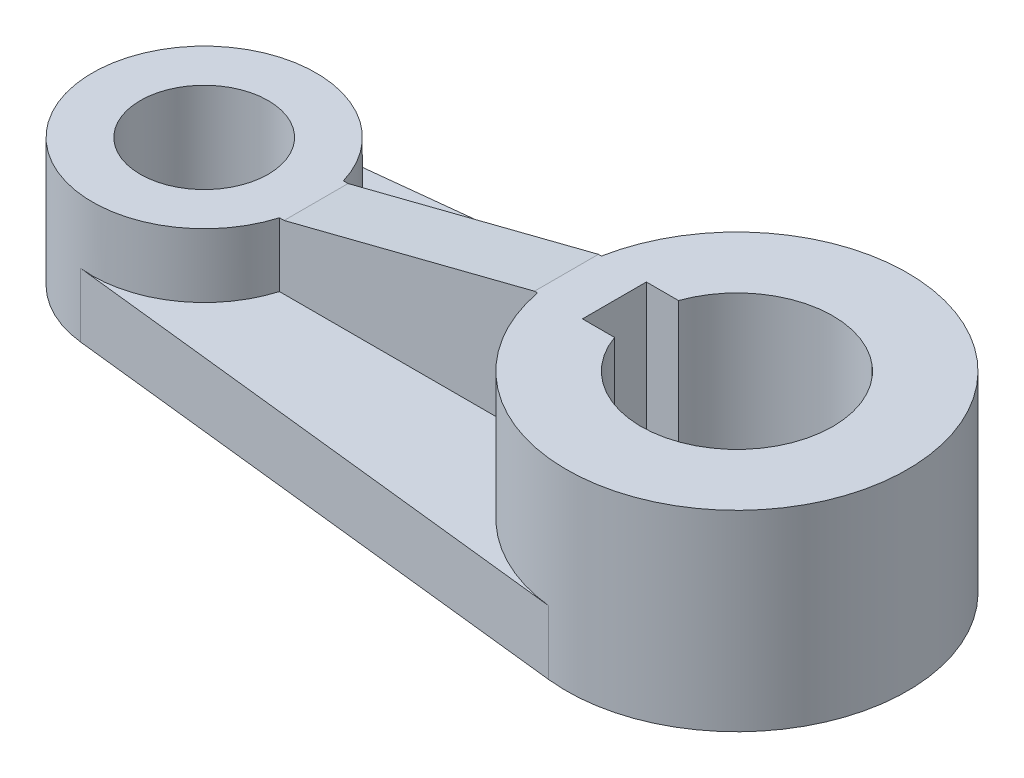
ISO-10303-21;
HEADER;
FILE_DESCRIPTION(('STEP AP214'),'2;1');
FILE_NAME('part.step','',(''),(''),'','','');
FILE_SCHEMA(('AUTOMOTIVE_DESIGN { 1 0 10303 214 1 1 1 1 }'));
ENDSEC;
DATA;
#1=APPLICATION_CONTEXT('core data for automotive mechanical design processes');
#2=APPLICATION_PROTOCOL_DEFINITION('international standard','automotive_design',2000,#1);
#3=PRODUCT_CONTEXT('',#1,'mechanical');
#4=PRODUCT('Part','Part','',(#3));
#5=PRODUCT_RELATED_PRODUCT_CATEGORY('part','',(#4));
#6=PRODUCT_DEFINITION_FORMATION('','',#4);
#7=PRODUCT_DEFINITION_CONTEXT('part definition',#1,'design');
#8=PRODUCT_DEFINITION('design','',#6,#7);
#9=PRODUCT_DEFINITION_SHAPE('','',#8);
#10=(LENGTH_UNIT() NAMED_UNIT(*) SI_UNIT(.MILLI.,.METRE.));
#11=(NAMED_UNIT(*) PLANE_ANGLE_UNIT() SI_UNIT($,.RADIAN.));
#12=(NAMED_UNIT(*) SI_UNIT($,.STERADIAN.) SOLID_ANGLE_UNIT());
#13=UNCERTAINTY_MEASURE_WITH_UNIT(LENGTH_MEASURE(1.E-05),#10,'distance_accuracy_value','');
#14=(GEOMETRIC_REPRESENTATION_CONTEXT(3) GLOBAL_UNCERTAINTY_ASSIGNED_CONTEXT((#13)) GLOBAL_UNIT_ASSIGNED_CONTEXT((#10,
#11,#12)) REPRESENTATION_CONTEXT('',''));
#15=CARTESIAN_POINT('',(0.,0.,0.));
#16=DIRECTION('',(0.,0.,1.));
#17=DIRECTION('',(1.,0.,0.));
#18=AXIS2_PLACEMENT_3D('',#15,#16,#17);
#19=CARTESIAN_POINT('',(-100.,12.,0.));
#20=DIRECTION('',(0.,-1.,0.));
#21=DIRECTION('',(0.,0.,-1.));
#22=AXIS2_PLACEMENT_3D('',#19,#20,#21);
#23=PLANE('',#22);
#24=DIRECTION('',(1.,0.,0.));
#25=VECTOR('',#24,1.);
#26=CARTESIAN_POINT('',(-30.3336555417471,12.,6.));
#27=LINE('',#26,#25);
#28=CARTESIAN_POINT('',(-79.8753882025019,12.,6.));
#29=VERTEX_POINT('',#28);
#30=CARTESIAN_POINT('',(-31.4324672910034,12.,6.));
#31=VERTEX_POINT('',#30);
#32=EDGE_CURVE('E154',#29,#31,#27,.T.);
#33=ORIENTED_EDGE('',*,*,#32,.F.);
#34=CARTESIAN_POINT('',(-100.,12.,0.));
#35=DIRECTION('',(0.,-1.,0.));
#36=DIRECTION('',(0.,0.,-1.));
#37=AXIS2_PLACEMENT_3D('',#34,#35,#36);
#38=CIRCLE('',#37,21.);
#39=CARTESIAN_POINT('',(-102.31,12.,20.8725633308418));
#40=VERTEX_POINT('',#39);
#41=EDGE_CURVE('E247',#40,#29,#38,.F.);
#42=ORIENTED_EDGE('',*,*,#41,.F.);
#43=DIRECTION('',(-0.993931587182941,0.,-0.11));
#44=VECTOR('',#43,1.);
#45=CARTESIAN_POINT('',(-102.31,12.,20.8725633308418));
#46=LINE('',#45,#44);
#47=CARTESIAN_POINT('',(-3.52,12.,31.8058107898541));
#48=VERTEX_POINT('',#47);
#49=EDGE_CURVE('E260',#48,#40,#46,.T.);
#50=ORIENTED_EDGE('',*,*,#49,.F.);
#51=CARTESIAN_POINT('',(0.,12.,0.));
#52=DIRECTION('',(0.,-1.,0.));
#53=DIRECTION('',(0.,0.,-1.));
#54=AXIS2_PLACEMENT_3D('',#51,#52,#53);
#55=CIRCLE('',#54,32.);
#56=EDGE_CURVE('E290',#48,#31,#55,.T.);
#57=ORIENTED_EDGE('',*,*,#56,.T.);
#58=EDGE_LOOP('',(#33,#42,#50,#57));
#59=FACE_BOUND('',#58,.T.);
#60=ADVANCED_FACE('F45',(#59),#23,.F.);
#61=CARTESIAN_POINT('',(0.,36.,0.));
#62=DIRECTION('',(0.,-1.,0.));
#63=DIRECTION('',(0.,0.,-1.));
#64=AXIS2_PLACEMENT_3D('',#61,#62,#63);
#65=CYLINDRICAL_SURFACE('',#64,32.);
#66=DIRECTION('',(0.,-1.,0.));
#67=VECTOR('',#66,1.);
#68=CARTESIAN_POINT('',(-31.4324672910034,36.,6.));
#69=LINE('',#68,#67);
#70=CARTESIAN_POINT('',(-31.4324672910034,36.,6.));
#71=VERTEX_POINT('',#70);
#72=EDGE_CURVE('E151',#31,#71,#69,.F.);
#73=ORIENTED_EDGE('',*,*,#72,.F.);
#74=ORIENTED_EDGE('',*,*,#56,.F.);
#75=DIRECTION('',(0.,-1.,0.));
#76=VECTOR('',#75,1.);
#77=CARTESIAN_POINT('',(-3.52,12.,31.8058107898541));
#78=LINE('',#77,#76);
#79=CARTESIAN_POINT('',(-3.52,0.,31.8058107898541));
#80=VERTEX_POINT('',#79);
#81=EDGE_CURVE('E280',#48,#80,#78,.T.);
#82=ORIENTED_EDGE('',*,*,#81,.T.);
#83=CARTESIAN_POINT('',(0.,0.,0.));
#84=DIRECTION('',(0.,1.,0.));
#85=DIRECTION('',(0.,0.,1.));
#86=AXIS2_PLACEMENT_3D('',#83,#84,#85);
#87=CIRCLE('',#86,32.);
#88=CARTESIAN_POINT('',(-3.52,0.,-31.8058107898541));
#89=VERTEX_POINT('',#88);
#90=EDGE_CURVE('E49',#80,#89,#87,.T.);
#91=ORIENTED_EDGE('',*,*,#90,.T.);
#92=DIRECTION('',(0.,-1.,0.));
#93=VECTOR('',#92,1.);
#94=CARTESIAN_POINT('',(-3.52000000000001,12.,-31.8058107898541));
#95=LINE('',#94,#93);
#96=CARTESIAN_POINT('',(-3.52000000000001,12.,-31.8058107898541));
#97=VERTEX_POINT('',#96);
#98=EDGE_CURVE('E284',#97,#89,#95,.T.);
#99=ORIENTED_EDGE('',*,*,#98,.F.);
#100=CARTESIAN_POINT('',(-31.4324672910034,12.,-6.));
#101=VERTEX_POINT('',#100);
#102=EDGE_CURVE('E279',#101,#97,#55,.T.);
#103=ORIENTED_EDGE('',*,*,#102,.F.);
#104=DIRECTION('',(0.,-1.,0.));
#105=VECTOR('',#104,1.);
#106=CARTESIAN_POINT('',(-31.4324672910034,36.,-6.));
#107=LINE('',#106,#105);
#108=CARTESIAN_POINT('',(-31.4324672910034,36.,-6.));
#109=VERTEX_POINT('',#108);
#110=EDGE_CURVE('E64',#101,#109,#107,.F.);
#111=ORIENTED_EDGE('',*,*,#110,.T.);
#112=CARTESIAN_POINT('',(0.,36.,0.));
#113=DIRECTION('',(0.,1.,0.));
#114=DIRECTION('',(0.,0.,1.));
#115=AXIS2_PLACEMENT_3D('',#112,#113,#114);
#116=CIRCLE('',#115,32.);
#117=EDGE_CURVE('E11',#71,#109,#116,.T.);
#118=ORIENTED_EDGE('',*,*,#117,.F.);
#119=EDGE_LOOP('',(#73,#74,#82,#91,#99,#103,#111,#118));
#120=FACE_BOUND('',#119,.T.);
#121=ADVANCED_FACE('F47',(#120),#65,.T.);
#122=CARTESIAN_POINT('',(-100.,12.,0.));
#123=DIRECTION('',(0.,-1.,0.));
#124=DIRECTION('',(0.,0.,-1.));
#125=AXIS2_PLACEMENT_3D('',#122,#123,#124);
#126=CYLINDRICAL_SURFACE('',#125,21.);
#127=ORIENTED_EDGE('',*,*,#41,.T.);
#128=DIRECTION('',(0.,-1.,0.));
#129=VECTOR('',#128,1.);
#130=CARTESIAN_POINT('',(-79.8753882025019,12.,6.));
#131=LINE('',#130,#129);
#132=CARTESIAN_POINT('',(-79.8753882025019,24.,6.));
#133=VERTEX_POINT('',#132);
#134=EDGE_CURVE('E197',#29,#133,#131,.F.);
#135=ORIENTED_EDGE('',*,*,#134,.T.);
#136=CARTESIAN_POINT('',(-100.,24.,0.));
#137=DIRECTION('',(0.,1.,0.));
#138=DIRECTION('',(0.,0.,1.));
#139=AXIS2_PLACEMENT_3D('',#136,#137,#138);
#140=CIRCLE('',#139,21.);
#141=CARTESIAN_POINT('',(-79.8753882025019,24.,-6.));
#142=VERTEX_POINT('',#141);
#143=EDGE_CURVE('E242',#142,#133,#140,.T.);
#144=ORIENTED_EDGE('',*,*,#143,.F.);
#145=DIRECTION('',(0.,-1.,0.));
#146=VECTOR('',#145,1.);
#147=CARTESIAN_POINT('',(-79.8753882025019,12.,-6.));
#148=LINE('',#147,#146);
#149=CARTESIAN_POINT('',(-79.8753882025019,12.,-6.));
#150=VERTEX_POINT('',#149);
#151=EDGE_CURVE('E166',#150,#142,#148,.F.);
#152=ORIENTED_EDGE('',*,*,#151,.F.);
#153=CARTESIAN_POINT('',(-102.31,12.,-20.8725633308418));
#154=VERTEX_POINT('',#153);
#155=EDGE_CURVE('E246',#150,#154,#38,.F.);
#156=ORIENTED_EDGE('',*,*,#155,.T.);
#157=DIRECTION('',(0.,-1.,0.));
#158=VECTOR('',#157,1.);
#159=CARTESIAN_POINT('',(-102.31,12.,-20.8725633308418));
#160=LINE('',#159,#158);
#161=CARTESIAN_POINT('',(-102.31,0.,-20.8725633308418));
#162=VERTEX_POINT('',#161);
#163=EDGE_CURVE('E265',#154,#162,#160,.T.);
#164=ORIENTED_EDGE('',*,*,#163,.T.);
#165=CARTESIAN_POINT('',(-100.,0.,0.));
#166=DIRECTION('',(0.,-1.,0.));
#167=DIRECTION('',(0.,0.,-1.));
#168=AXIS2_PLACEMENT_3D('',#165,#166,#167);
#169=CIRCLE('',#168,21.);
#170=CARTESIAN_POINT('',(-102.31,0.,20.8725633308418));
#171=VERTEX_POINT('',#170);
#172=EDGE_CURVE('E255',#171,#162,#169,.T.);
#173=ORIENTED_EDGE('',*,*,#172,.F.);
#174=DIRECTION('',(0.,-1.,0.));
#175=VECTOR('',#174,1.);
#176=CARTESIAN_POINT('',(-102.31,12.,20.8725633308418));
#177=LINE('',#176,#175);
#178=EDGE_CURVE('E276',#40,#171,#177,.T.);
#179=ORIENTED_EDGE('',*,*,#178,.F.);
#180=EDGE_LOOP('',(#127,#135,#144,#152,#156,#164,#173,#179));
#181=FACE_BOUND('',#180,.T.);
#182=ADVANCED_FACE('F336',(#181),#126,.T.);
#183=ORIENTED_EDGE('',*,*,#155,.F.);
#184=DIRECTION('',(1.,0.,0.));
#185=VECTOR('',#184,1.);
#186=CARTESIAN_POINT('',(-30.3336555417471,12.,-6.));
#187=LINE('',#186,#185);
#188=EDGE_CURVE('E178',#150,#101,#187,.T.);
#189=ORIENTED_EDGE('',*,*,#188,.T.);
#190=ORIENTED_EDGE('',*,*,#102,.T.);
#191=DIRECTION('',(0.993931587182941,0.,-0.11));
#192=VECTOR('',#191,1.);
#193=CARTESIAN_POINT('',(-102.31,12.,-20.8725633308418));
#194=LINE('',#193,#192);
#195=EDGE_CURVE('E256',#154,#97,#194,.T.);
#196=ORIENTED_EDGE('',*,*,#195,.F.);
#197=EDGE_LOOP('',(#183,#189,#190,#196));
#198=FACE_BOUND('',#197,.T.);
#199=ADVANCED_FACE('F332',(#198),#23,.F.);
#200=CARTESIAN_POINT('',(0.,36.,0.));
#201=DIRECTION('',(0.,1.,0.));
#202=DIRECTION('',(0.,0.,1.));
#203=AXIS2_PLACEMENT_3D('',#200,#201,#202);
#204=PLANE('',#203);
#205=DIRECTION('',(-1.,0.,0.));
#206=VECTOR('',#205,1.);
#207=CARTESIAN_POINT('',(-32.,36.,6.));
#208=LINE('',#207,#206);
#209=CARTESIAN_POINT('',(-32.,36.,6.));
#210=VERTEX_POINT('',#209);
#211=EDGE_CURVE('E143',#71,#210,#208,.T.);
#212=ORIENTED_EDGE('',*,*,#211,.F.);
#213=ORIENTED_EDGE('',*,*,#117,.T.);
#214=DIRECTION('',(-1.,0.,0.));
#215=VECTOR('',#214,1.);
#216=CARTESIAN_POINT('',(-32.,36.,-6.));
#217=LINE('',#216,#215);
#218=CARTESIAN_POINT('',(-32.,36.,-6.));
#219=VERTEX_POINT('',#218);
#220=EDGE_CURVE('E161',#109,#219,#217,.T.);
#221=ORIENTED_EDGE('',*,*,#220,.T.);
#222=DIRECTION('',(0.,0.,-1.));
#223=VECTOR('',#222,1.);
#224=CARTESIAN_POINT('',(-32.,36.,6.));
#225=LINE('',#224,#223);
#226=EDGE_CURVE('E157',#210,#219,#225,.T.);
#227=ORIENTED_EDGE('',*,*,#226,.F.);
#228=EDGE_LOOP('',(#212,#213,#221,#227));
#229=FACE_BOUND('',#228,.T.);
#230=DIRECTION('',(-1.,0.,0.));
#231=VECTOR('',#230,1.);
#232=CARTESIAN_POINT('',(-23.0005627484771,36.,-6.));
#233=LINE('',#232,#231);
#234=CARTESIAN_POINT('',(-16.9705627484771,36.,-6.));
#235=VERTEX_POINT('',#234);
#236=CARTESIAN_POINT('',(-23.0005627484771,36.,-6.));
#237=VERTEX_POINT('',#236);
#238=EDGE_CURVE('E208',#235,#237,#233,.T.);
#239=ORIENTED_EDGE('',*,*,#238,.F.);
#240=CARTESIAN_POINT('',(0.,36.,0.));
#241=DIRECTION('',(0.,1.,0.));
#242=DIRECTION('',(0.,0.,1.));
#243=AXIS2_PLACEMENT_3D('',#240,#241,#242);
#244=CIRCLE('',#243,18.);
#245=CARTESIAN_POINT('',(-16.9705627484771,36.,6.00000000000001));
#246=VERTEX_POINT('',#245);
#247=EDGE_CURVE('E295',#246,#235,#244,.T.);
#248=ORIENTED_EDGE('',*,*,#247,.F.);
#249=DIRECTION('',(1.,0.,0.));
#250=VECTOR('',#249,1.);
#251=CARTESIAN_POINT('',(-23.0005627484771,36.,6.));
#252=LINE('',#251,#250);
#253=CARTESIAN_POINT('',(-23.0005627484771,36.,6.));
#254=VERTEX_POINT('',#253);
#255=EDGE_CURVE('E220',#254,#246,#252,.T.);
#256=ORIENTED_EDGE('',*,*,#255,.F.);
#257=DIRECTION('',(0.,0.,1.));
#258=VECTOR('',#257,1.);
#259=CARTESIAN_POINT('',(-23.0005627484771,36.,-6.));
#260=LINE('',#259,#258);
#261=EDGE_CURVE('E202',#237,#254,#260,.T.);
#262=ORIENTED_EDGE('',*,*,#261,.F.);
#263=EDGE_LOOP('',(#239,#248,#256,#262));
#264=FACE_BOUND('',#263,.T.);
#265=ADVANCED_FACE('F158',(#229,#264),#204,.T.);
#266=CARTESIAN_POINT('',(0.,0.,0.));
#267=DIRECTION('',(0.,1.,0.));
#268=DIRECTION('',(0.,0.,1.));
#269=AXIS2_PLACEMENT_3D('',#266,#267,#268);
#270=PLANE('',#269);
#271=ORIENTED_EDGE('',*,*,#172,.T.);
#272=DIRECTION('',(0.993931587182941,0.,-0.11));
#273=VECTOR('',#272,1.);
#274=CARTESIAN_POINT('',(-102.31,0.,-20.8725633308418));
#275=LINE('',#274,#273);
#276=EDGE_CURVE('E269',#162,#89,#275,.T.);
#277=ORIENTED_EDGE('',*,*,#276,.T.);
#278=ORIENTED_EDGE('',*,*,#90,.F.);
#279=DIRECTION('',(-0.993931587182941,0.,-0.11));
#280=VECTOR('',#279,1.);
#281=CARTESIAN_POINT('',(-102.31,0.,20.8725633308418));
#282=LINE('',#281,#280);
#283=EDGE_CURVE('E261',#80,#171,#282,.T.);
#284=ORIENTED_EDGE('',*,*,#283,.T.);
#285=EDGE_LOOP('',(#271,#277,#278,#284));
#286=FACE_BOUND('',#285,.T.);
#287=CARTESIAN_POINT('',(-100.,0.,0.));
#288=DIRECTION('',(0.,-1.,0.));
#289=DIRECTION('',(0.,0.,-1.));
#290=AXIS2_PLACEMENT_3D('',#287,#288,#289);
#291=CIRCLE('',#290,12.);
#292=CARTESIAN_POINT('',(-100.,0.,-12.));
#293=VERTEX_POINT('',#292);
#294=EDGE_CURVE('E251',#293,#293,#291,.T.);
#295=ORIENTED_EDGE('',*,*,#294,.F.);
#296=EDGE_LOOP('',(#295));
#297=FACE_BOUND('',#296,.T.);
#298=CARTESIAN_POINT('',(0.,0.,0.));
#299=DIRECTION('',(0.,1.,0.));
#300=DIRECTION('',(0.,0.,1.));
#301=AXIS2_PLACEMENT_3D('',#298,#299,#300);
#302=CIRCLE('',#301,18.);
#303=CARTESIAN_POINT('',(-16.9705627484771,0.,6.00000000000001));
#304=VERTEX_POINT('',#303);
#305=CARTESIAN_POINT('',(-16.9705627484771,0.,-6.));
#306=VERTEX_POINT('',#305);
#307=EDGE_CURVE('E294',#304,#306,#302,.T.);
#308=ORIENTED_EDGE('',*,*,#307,.T.);
#309=DIRECTION('',(-1.,0.,0.));
#310=VECTOR('',#309,1.);
#311=CARTESIAN_POINT('',(-23.0005627484771,0.,-6.));
#312=LINE('',#311,#310);
#313=CARTESIAN_POINT('',(-23.0005627484771,0.,-6.));
#314=VERTEX_POINT('',#313);
#315=EDGE_CURVE('E212',#306,#314,#312,.T.);
#316=ORIENTED_EDGE('',*,*,#315,.T.);
#317=DIRECTION('',(0.,0.,1.));
#318=VECTOR('',#317,1.);
#319=CARTESIAN_POINT('',(-23.0005627484771,0.,-6.));
#320=LINE('',#319,#318);
#321=CARTESIAN_POINT('',(-23.0005627484771,0.,6.));
#322=VERTEX_POINT('',#321);
#323=EDGE_CURVE('E203',#314,#322,#320,.T.);
#324=ORIENTED_EDGE('',*,*,#323,.T.);
#325=DIRECTION('',(1.,0.,0.));
#326=VECTOR('',#325,1.);
#327=CARTESIAN_POINT('',(-23.0005627484771,0.,6.));
#328=LINE('',#327,#326);
#329=EDGE_CURVE('E207',#322,#304,#328,.T.);
#330=ORIENTED_EDGE('',*,*,#329,.T.);
#331=EDGE_LOOP('',(#308,#316,#324,#330));
#332=FACE_BOUND('',#331,.T.);
#333=ADVANCED_FACE('F303',(#286,#297,#332),#270,.F.);
#334=CARTESIAN_POINT('',(0.,36.,0.));
#335=DIRECTION('',(0.,-1.,0.));
#336=DIRECTION('',(0.,0.,-1.));
#337=AXIS2_PLACEMENT_3D('',#334,#335,#336);
#338=CYLINDRICAL_SURFACE('',#337,18.);
#339=DIRECTION('',(0.,1.,0.));
#340=VECTOR('',#339,1.);
#341=CARTESIAN_POINT('',(-16.9705627484771,0.,-6.));
#342=LINE('',#341,#340);
#343=EDGE_CURVE('E230',#306,#235,#342,.T.);
#344=ORIENTED_EDGE('',*,*,#343,.F.);
#345=ORIENTED_EDGE('',*,*,#307,.F.);
#346=DIRECTION('',(0.,1.,0.));
#347=VECTOR('',#346,1.);
#348=CARTESIAN_POINT('',(-16.9705627484771,0.,6.00000000000001));
#349=LINE('',#348,#347);
#350=EDGE_CURVE('E233',#304,#246,#349,.T.);
#351=ORIENTED_EDGE('',*,*,#350,.T.);
#352=ORIENTED_EDGE('',*,*,#247,.T.);
#353=EDGE_LOOP('',(#344,#345,#351,#352));
#354=FACE_BOUND('',#353,.T.);
#355=ADVANCED_FACE('F307',(#354),#338,.F.);
#356=CARTESIAN_POINT('',(-102.31,12.,20.8725633308418));
#357=DIRECTION('',(-0.11,0.,0.993931587182941));
#358=DIRECTION('',(0.993931587182941,0.,0.11));
#359=AXIS2_PLACEMENT_3D('',#356,#357,#358);
#360=PLANE('',#359);
#361=ORIENTED_EDGE('',*,*,#283,.F.);
#362=ORIENTED_EDGE('',*,*,#81,.F.);
#363=ORIENTED_EDGE('',*,*,#49,.T.);
#364=ORIENTED_EDGE('',*,*,#178,.T.);
#365=EDGE_LOOP('',(#361,#362,#363,#364));
#366=FACE_BOUND('',#365,.T.);
#367=ADVANCED_FACE('F366',(#366),#360,.T.);
#368=CARTESIAN_POINT('',(-102.31,12.,-20.8725633308418));
#369=DIRECTION('',(-0.11,0.,-0.993931587182941));
#370=DIRECTION('',(-0.993931587182941,0.,0.11));
#371=AXIS2_PLACEMENT_3D('',#368,#369,#370);
#372=PLANE('',#371);
#373=ORIENTED_EDGE('',*,*,#276,.F.);
#374=ORIENTED_EDGE('',*,*,#163,.F.);
#375=ORIENTED_EDGE('',*,*,#195,.T.);
#376=ORIENTED_EDGE('',*,*,#98,.T.);
#377=EDGE_LOOP('',(#373,#374,#375,#376));
#378=FACE_BOUND('',#377,.T.);
#379=ADVANCED_FACE('F373',(#378),#372,.T.);
#380=CARTESIAN_POINT('',(-100.,12.,0.));
#381=DIRECTION('',(0.,-1.,0.));
#382=DIRECTION('',(0.,0.,-1.));
#383=AXIS2_PLACEMENT_3D('',#380,#381,#382);
#384=CYLINDRICAL_SURFACE('',#383,12.);
#385=ORIENTED_EDGE('',*,*,#294,.T.);
#386=EDGE_LOOP('',(#385));
#387=FACE_BOUND('',#386,.T.);
#388=CARTESIAN_POINT('',(-100.,24.,0.));
#389=DIRECTION('',(0.,1.,0.));
#390=DIRECTION('',(0.,0.,1.));
#391=AXIS2_PLACEMENT_3D('',#388,#389,#390);
#392=CIRCLE('',#391,12.);
#393=CARTESIAN_POINT('',(-100.,24.,12.));
#394=VERTEX_POINT('',#393);
#395=EDGE_CURVE('E229',#394,#394,#392,.T.);
#396=ORIENTED_EDGE('',*,*,#395,.T.);
#397=EDGE_LOOP('',(#396));
#398=FACE_BOUND('',#397,.T.);
#399=ADVANCED_FACE('F375',(#387,#398),#384,.F.);
#400=CARTESIAN_POINT('',(-100.,24.,0.));
#401=DIRECTION('',(0.,1.,0.));
#402=DIRECTION('',(0.,0.,1.));
#403=AXIS2_PLACEMENT_3D('',#400,#401,#402);
#404=PLANE('',#403);
#405=ORIENTED_EDGE('',*,*,#143,.T.);
#406=DIRECTION('',(-1.,0.,0.));
#407=VECTOR('',#406,1.);
#408=CARTESIAN_POINT('',(-80.173004722158,24.,6.));
#409=LINE('',#408,#407);
#410=CARTESIAN_POINT('',(-79.,24.,6.));
#411=VERTEX_POINT('',#410);
#412=EDGE_CURVE('E172',#411,#133,#409,.T.);
#413=ORIENTED_EDGE('',*,*,#412,.F.);
#414=DIRECTION('',(0.,0.,-1.));
#415=VECTOR('',#414,1.);
#416=CARTESIAN_POINT('',(-79.,24.,6.));
#417=LINE('',#416,#415);
#418=CARTESIAN_POINT('',(-79.,24.,-6.));
#419=VERTEX_POINT('',#418);
#420=EDGE_CURVE('E167',#411,#419,#417,.T.);
#421=ORIENTED_EDGE('',*,*,#420,.T.);
#422=DIRECTION('',(-1.,0.,0.));
#423=VECTOR('',#422,1.);
#424=CARTESIAN_POINT('',(-80.173004722158,24.,-6.));
#425=LINE('',#424,#423);
#426=EDGE_CURVE('E186',#419,#142,#425,.T.);
#427=ORIENTED_EDGE('',*,*,#426,.T.);
#428=EDGE_LOOP('',(#405,#413,#421,#427));
#429=FACE_BOUND('',#428,.T.);
#430=ORIENTED_EDGE('',*,*,#395,.F.);
#431=EDGE_LOOP('',(#430));
#432=FACE_BOUND('',#431,.T.);
#433=ADVANCED_FACE('F356',(#429,#432),#404,.T.);
#434=CARTESIAN_POINT('',(-23.0005627484771,0.,-6.));
#435=DIRECTION('',(-1.,0.,0.));
#436=DIRECTION('',(0.,0.,1.));
#437=AXIS2_PLACEMENT_3D('',#434,#435,#436);
#438=PLANE('',#437);
#439=ORIENTED_EDGE('',*,*,#261,.T.);
#440=DIRECTION('',(0.,1.,0.));
#441=VECTOR('',#440,1.);
#442=CARTESIAN_POINT('',(-23.0005627484771,0.,6.));
#443=LINE('',#442,#441);
#444=EDGE_CURVE('E216',#322,#254,#443,.T.);
#445=ORIENTED_EDGE('',*,*,#444,.F.);
#446=ORIENTED_EDGE('',*,*,#323,.F.);
#447=DIRECTION('',(0.,1.,0.));
#448=VECTOR('',#447,1.);
#449=CARTESIAN_POINT('',(-23.0005627484771,0.,-6.));
#450=LINE('',#449,#448);
#451=EDGE_CURVE('E226',#314,#237,#450,.T.);
#452=ORIENTED_EDGE('',*,*,#451,.T.);
#453=EDGE_LOOP('',(#439,#445,#446,#452));
#454=FACE_BOUND('',#453,.T.);
#455=ADVANCED_FACE('F315',(#454),#438,.F.);
#456=CARTESIAN_POINT('',(-23.0005627484771,0.,-6.));
#457=DIRECTION('',(0.,0.,-1.));
#458=DIRECTION('',(-1.,0.,0.));
#459=AXIS2_PLACEMENT_3D('',#456,#457,#458);
#460=PLANE('',#459);
#461=ORIENTED_EDGE('',*,*,#238,.T.);
#462=ORIENTED_EDGE('',*,*,#451,.F.);
#463=ORIENTED_EDGE('',*,*,#315,.F.);
#464=ORIENTED_EDGE('',*,*,#343,.T.);
#465=EDGE_LOOP('',(#461,#462,#463,#464));
#466=FACE_BOUND('',#465,.T.);
#467=ADVANCED_FACE('F311',(#466),#460,.F.);
#468=CARTESIAN_POINT('',(-23.0005627484771,0.,6.));
#469=DIRECTION('',(0.,0.,1.));
#470=DIRECTION('',(1.,0.,0.));
#471=AXIS2_PLACEMENT_3D('',#468,#469,#470);
#472=PLANE('',#471);
#473=ORIENTED_EDGE('',*,*,#255,.T.);
#474=ORIENTED_EDGE('',*,*,#350,.F.);
#475=ORIENTED_EDGE('',*,*,#329,.F.);
#476=ORIENTED_EDGE('',*,*,#444,.T.);
#477=EDGE_LOOP('',(#473,#474,#475,#476));
#478=FACE_BOUND('',#477,.T.);
#479=ADVANCED_FACE('F318',(#478),#472,.F.);
#480=CARTESIAN_POINT('',(0.,0.,6.));
#481=DIRECTION('',(0.,0.,-1.));
#482=DIRECTION('',(-1.,0.,0.));
#483=AXIS2_PLACEMENT_3D('',#480,#481,#482);
#484=PLANE('',#483);
#485=ORIENTED_EDGE('',*,*,#32,.T.);
#486=ORIENTED_EDGE('',*,*,#72,.T.);
#487=ORIENTED_EDGE('',*,*,#211,.T.);
#488=DIRECTION('',(-0.968917710624463,-0.24738324526582,0.));
#489=VECTOR('',#488,1.);
#490=CARTESIAN_POINT('',(-79.,24.,6.));
#491=LINE('',#490,#489);
#492=EDGE_CURVE('E149',#210,#411,#491,.T.);
#493=ORIENTED_EDGE('',*,*,#492,.T.);
#494=ORIENTED_EDGE('',*,*,#412,.T.);
#495=ORIENTED_EDGE('',*,*,#134,.F.);
#496=EDGE_LOOP('',(#485,#486,#487,#493,#494,#495));
#497=FACE_BOUND('',#496,.T.);
#498=ADVANCED_FACE('F146',(#497),#484,.F.);
#499=CARTESIAN_POINT('',(0.,0.,-6.));
#500=DIRECTION('',(0.,0.,-1.));
#501=DIRECTION('',(-1.,0.,0.));
#502=AXIS2_PLACEMENT_3D('',#499,#500,#501);
#503=PLANE('',#502);
#504=ORIENTED_EDGE('',*,*,#110,.F.);
#505=ORIENTED_EDGE('',*,*,#188,.F.);
#506=ORIENTED_EDGE('',*,*,#151,.T.);
#507=ORIENTED_EDGE('',*,*,#426,.F.);
#508=DIRECTION('',(-0.968917710624463,-0.24738324526582,0.));
#509=VECTOR('',#508,1.);
#510=CARTESIAN_POINT('',(-79.,24.,-6.));
#511=LINE('',#510,#509);
#512=EDGE_CURVE('E183',#219,#419,#511,.T.);
#513=ORIENTED_EDGE('',*,*,#512,.F.);
#514=ORIENTED_EDGE('',*,*,#220,.F.);
#515=EDGE_LOOP('',(#504,#505,#506,#507,#513,#514));
#516=FACE_BOUND('',#515,.T.);
#517=ADVANCED_FACE('F326',(#516),#503,.T.);
#518=CARTESIAN_POINT('',(-79.,24.,6.));
#519=DIRECTION('',(0.24738324526582,-0.968917710624463,0.));
#520=DIRECTION('',(0.968917710624463,0.24738324526582,0.));
#521=AXIS2_PLACEMENT_3D('',#518,#519,#520);
#522=PLANE('',#521);
#523=ORIENTED_EDGE('',*,*,#512,.T.);
#524=ORIENTED_EDGE('',*,*,#420,.F.);
#525=ORIENTED_EDGE('',*,*,#492,.F.);
#526=ORIENTED_EDGE('',*,*,#226,.T.);
#527=EDGE_LOOP('',(#523,#524,#525,#526));
#528=FACE_BOUND('',#527,.T.);
#529=ADVANCED_FACE('F169',(#528),#522,.F.);
#530=CLOSED_SHELL('',(#60,#121,#182,#199,#265,#333,#355,#367,#379,#399,#433,#455,#467,#479,#498,
#517,#529));
#531=MANIFOLD_SOLID_BREP('B2',#530);
#532=ADVANCED_BREP_SHAPE_REPRESENTATION('',(#18,#531),#14);
#533=SHAPE_DEFINITION_REPRESENTATION(#9,#532);
ENDSEC;
END-ISO-10303-21;
